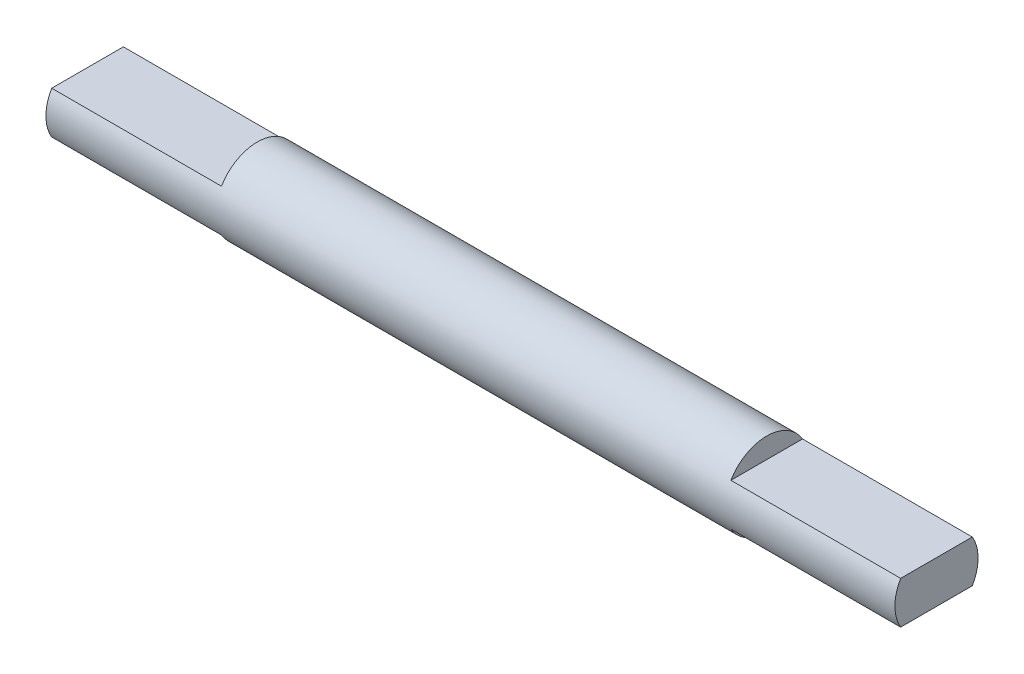
ISO-10303-21;
HEADER;
FILE_DESCRIPTION(('STEP AP214'),'2;1');
FILE_NAME('part.step','',(''),(''),'','','');
FILE_SCHEMA(('AUTOMOTIVE_DESIGN { 1 0 10303 214 1 1 1 1 }'));
ENDSEC;
DATA;
#1=APPLICATION_CONTEXT('core data for automotive mechanical design processes');
#2=APPLICATION_PROTOCOL_DEFINITION('international standard','automotive_design',2000,#1);
#3=PRODUCT_CONTEXT('',#1,'mechanical');
#4=PRODUCT('Part','Part','',(#3));
#5=PRODUCT_RELATED_PRODUCT_CATEGORY('part','',(#4));
#6=PRODUCT_DEFINITION_FORMATION('','',#4);
#7=PRODUCT_DEFINITION_CONTEXT('part definition',#1,'design');
#8=PRODUCT_DEFINITION('design','',#6,#7);
#9=PRODUCT_DEFINITION_SHAPE('','',#8);
#10=(LENGTH_UNIT() NAMED_UNIT(*) SI_UNIT(.MILLI.,.METRE.));
#11=(NAMED_UNIT(*) PLANE_ANGLE_UNIT() SI_UNIT($,.RADIAN.));
#12=(NAMED_UNIT(*) SI_UNIT($,.STERADIAN.) SOLID_ANGLE_UNIT());
#13=UNCERTAINTY_MEASURE_WITH_UNIT(LENGTH_MEASURE(1.E-05),#10,'distance_accuracy_value','');
#14=(GEOMETRIC_REPRESENTATION_CONTEXT(3) GLOBAL_UNCERTAINTY_ASSIGNED_CONTEXT((#13)) GLOBAL_UNIT_ASSIGNED_CONTEXT((#10,
#11,#12)) REPRESENTATION_CONTEXT('',''));
#15=CARTESIAN_POINT('',(0.,0.,0.));
#16=DIRECTION('',(0.,0.,1.));
#17=DIRECTION('',(1.,0.,0.));
#18=AXIS2_PLACEMENT_3D('',#15,#16,#17);
#19=CARTESIAN_POINT('',(50.,0.,0.));
#20=DIRECTION('',(-1.,0.,0.));
#21=DIRECTION('',(0.,0.,1.));
#22=AXIS2_PLACEMENT_3D('',#19,#20,#21);
#23=CYLINDRICAL_SURFACE('',#22,2.45);
#24=CARTESIAN_POINT('',(50.,0.,0.));
#25=DIRECTION('',(1.,0.,0.));
#26=DIRECTION('',(0.,0.,-1.));
#27=AXIS2_PLACEMENT_3D('',#24,#25,#26);
#28=CIRCLE('',#27,2.45);
#29=CARTESIAN_POINT('',(50.,-1.245,-2.1100888606881));
#30=VERTEX_POINT('',#29);
#31=CARTESIAN_POINT('',(50.,1.245,-2.1100888606881));
#32=VERTEX_POINT('',#31);
#33=EDGE_CURVE('E40',#30,#32,#28,.T.);
#34=ORIENTED_EDGE('',*,*,#33,.F.);
#35=DIRECTION('',(1.,0.,0.));
#36=VECTOR('',#35,1.);
#37=CARTESIAN_POINT('',(40.,-1.245,-2.1100888606881));
#38=LINE('',#37,#36);
#39=CARTESIAN_POINT('',(40.,-1.245,-2.1100888606881));
#40=VERTEX_POINT('',#39);
#41=EDGE_CURVE('E132',#40,#30,#38,.T.);
#42=ORIENTED_EDGE('',*,*,#41,.F.);
#43=CARTESIAN_POINT('',(40.,0.,0.));
#44=DIRECTION('',(1.,0.,0.));
#45=DIRECTION('',(0.,0.,-1.));
#46=AXIS2_PLACEMENT_3D('',#43,#44,#45);
#47=CIRCLE('',#46,2.45);
#48=CARTESIAN_POINT('',(40.,-1.245,2.1100888606881));
#49=VERTEX_POINT('',#48);
#50=EDGE_CURVE('E127',#49,#40,#47,.T.);
#51=ORIENTED_EDGE('',*,*,#50,.F.);
#52=DIRECTION('',(1.,0.,0.));
#53=VECTOR('',#52,1.);
#54=CARTESIAN_POINT('',(40.,-1.245,2.1100888606881));
#55=LINE('',#54,#53);
#56=CARTESIAN_POINT('',(50.,-1.245,2.1100888606881));
#57=VERTEX_POINT('',#56);
#58=EDGE_CURVE('E134',#49,#57,#55,.T.);
#59=ORIENTED_EDGE('',*,*,#58,.T.);
#60=CARTESIAN_POINT('',(50.,1.245,2.1100888606881));
#61=VERTEX_POINT('',#60);
#62=EDGE_CURVE('E11',#61,#57,#28,.T.);
#63=ORIENTED_EDGE('',*,*,#62,.F.);
#64=DIRECTION('',(1.,0.,0.));
#65=VECTOR('',#64,1.);
#66=CARTESIAN_POINT('',(40.,1.245,2.1100888606881));
#67=LINE('',#66,#65);
#68=CARTESIAN_POINT('',(40.,1.245,2.1100888606881));
#69=VERTEX_POINT('',#68);
#70=EDGE_CURVE('E144',#69,#61,#67,.T.);
#71=ORIENTED_EDGE('',*,*,#70,.F.);
#72=CARTESIAN_POINT('',(40.,0.,0.));
#73=DIRECTION('',(1.,0.,0.));
#74=DIRECTION('',(0.,0.,1.));
#75=AXIS2_PLACEMENT_3D('',#72,#73,#74);
#76=CIRCLE('',#75,2.45);
#77=CARTESIAN_POINT('',(40.,1.245,-2.1100888606881));
#78=VERTEX_POINT('',#77);
#79=EDGE_CURVE('E139',#78,#69,#76,.T.);
#80=ORIENTED_EDGE('',*,*,#79,.F.);
#81=DIRECTION('',(1.,0.,0.));
#82=VECTOR('',#81,1.);
#83=CARTESIAN_POINT('',(40.,1.245,-2.1100888606881));
#84=LINE('',#83,#82);
#85=EDGE_CURVE('E147',#78,#32,#84,.T.);
#86=ORIENTED_EDGE('',*,*,#85,.T.);
#87=EDGE_LOOP('',(#34,#42,#51,#59,#63,#71,#80,#86));
#88=FACE_BOUND('',#87,.T.);
#89=DIRECTION('',(-1.,0.,0.));
#90=VECTOR('',#89,1.);
#91=CARTESIAN_POINT('',(10.,-1.245,2.1100888606881));
#92=LINE('',#91,#90);
#93=CARTESIAN_POINT('',(10.,-1.245,2.1100888606881));
#94=VERTEX_POINT('',#93);
#95=CARTESIAN_POINT('',(0.,-1.245,2.1100888606881));
#96=VERTEX_POINT('',#95);
#97=EDGE_CURVE('E47',#94,#96,#92,.T.);
#98=ORIENTED_EDGE('',*,*,#97,.F.);
#99=CARTESIAN_POINT('',(10.,0.,0.));
#100=DIRECTION('',(1.,0.,0.));
#101=DIRECTION('',(0.,0.,-1.));
#102=AXIS2_PLACEMENT_3D('',#99,#100,#101);
#103=CIRCLE('',#102,2.45);
#104=CARTESIAN_POINT('',(10.,-1.245,-2.1100888606881));
#105=VERTEX_POINT('',#104);
#106=EDGE_CURVE('E102',#94,#105,#103,.T.);
#107=ORIENTED_EDGE('',*,*,#106,.T.);
#108=DIRECTION('',(-1.,0.,0.));
#109=VECTOR('',#108,1.);
#110=CARTESIAN_POINT('',(10.,-1.245,-2.1100888606881));
#111=LINE('',#110,#109);
#112=CARTESIAN_POINT('',(0.,-1.245,-2.1100888606881));
#113=VERTEX_POINT('',#112);
#114=EDGE_CURVE('E104',#105,#113,#111,.T.);
#115=ORIENTED_EDGE('',*,*,#114,.T.);
#116=CARTESIAN_POINT('',(0.,0.,0.));
#117=DIRECTION('',(1.,0.,0.));
#118=DIRECTION('',(0.,0.,-1.));
#119=AXIS2_PLACEMENT_3D('',#116,#117,#118);
#120=CIRCLE('',#119,2.45);
#121=CARTESIAN_POINT('',(0.,1.245,-2.1100888606881));
#122=VERTEX_POINT('',#121);
#123=EDGE_CURVE('E55',#113,#122,#120,.T.);
#124=ORIENTED_EDGE('',*,*,#123,.T.);
#125=DIRECTION('',(-1.,0.,0.));
#126=VECTOR('',#125,1.);
#127=CARTESIAN_POINT('',(10.,1.245,-2.1100888606881));
#128=LINE('',#127,#126);
#129=CARTESIAN_POINT('',(10.,1.245,-2.1100888606881));
#130=VERTEX_POINT('',#129);
#131=EDGE_CURVE('E119',#130,#122,#128,.T.);
#132=ORIENTED_EDGE('',*,*,#131,.F.);
#133=CARTESIAN_POINT('',(10.,0.,0.));
#134=DIRECTION('',(1.,0.,0.));
#135=DIRECTION('',(0.,0.,-1.));
#136=AXIS2_PLACEMENT_3D('',#133,#134,#135);
#137=CIRCLE('',#136,2.45);
#138=CARTESIAN_POINT('',(10.,1.245,2.1100888606881));
#139=VERTEX_POINT('',#138);
#140=EDGE_CURVE('E114',#130,#139,#137,.T.);
#141=ORIENTED_EDGE('',*,*,#140,.T.);
#142=DIRECTION('',(-1.,0.,0.));
#143=VECTOR('',#142,1.);
#144=CARTESIAN_POINT('',(10.,1.245,2.1100888606881));
#145=LINE('',#144,#143);
#146=CARTESIAN_POINT('',(0.,1.245,2.1100888606881));
#147=VERTEX_POINT('',#146);
#148=EDGE_CURVE('E123',#139,#147,#145,.T.);
#149=ORIENTED_EDGE('',*,*,#148,.T.);
#150=EDGE_CURVE('E35',#147,#96,#120,.T.);
#151=ORIENTED_EDGE('',*,*,#150,.T.);
#152=EDGE_LOOP('',(#98,#107,#115,#124,#132,#141,#149,#151));
#153=FACE_BOUND('',#152,.T.);
#154=ADVANCED_FACE('F32',(#88,#153),#23,.T.);
#155=CARTESIAN_POINT('',(0.,0.,0.));
#156=DIRECTION('',(1.,0.,0.));
#157=DIRECTION('',(0.,0.,-1.));
#158=AXIS2_PLACEMENT_3D('',#155,#156,#157);
#159=PLANE('',#158);
#160=DIRECTION('',(0.,0.,1.));
#161=VECTOR('',#160,1.);
#162=CARTESIAN_POINT('',(0.,-1.245,0.));
#163=LINE('',#162,#161);
#164=EDGE_CURVE('E106',#113,#96,#163,.T.);
#165=ORIENTED_EDGE('',*,*,#164,.T.);
#166=ORIENTED_EDGE('',*,*,#150,.F.);
#167=DIRECTION('',(0.,0.,-1.));
#168=VECTOR('',#167,1.);
#169=CARTESIAN_POINT('',(0.,1.245,0.));
#170=LINE('',#169,#168);
#171=EDGE_CURVE('E107',#147,#122,#170,.T.);
#172=ORIENTED_EDGE('',*,*,#171,.T.);
#173=ORIENTED_EDGE('',*,*,#123,.F.);
#174=EDGE_LOOP('',(#165,#166,#172,#173));
#175=FACE_BOUND('',#174,.T.);
#176=ADVANCED_FACE('F182',(#175),#159,.F.);
#177=CARTESIAN_POINT('',(50.,0.,0.));
#178=DIRECTION('',(1.,0.,0.));
#179=DIRECTION('',(0.,0.,-1.));
#180=AXIS2_PLACEMENT_3D('',#177,#178,#179);
#181=PLANE('',#180);
#182=DIRECTION('',(0.,0.,1.));
#183=VECTOR('',#182,1.);
#184=CARTESIAN_POINT('',(50.,-1.245,2.1100888606881));
#185=LINE('',#184,#183);
#186=EDGE_CURVE('E126',#30,#57,#185,.T.);
#187=ORIENTED_EDGE('',*,*,#186,.F.);
#188=ORIENTED_EDGE('',*,*,#33,.T.);
#189=DIRECTION('',(0.,0.,-1.));
#190=VECTOR('',#189,1.);
#191=CARTESIAN_POINT('',(50.,1.245,2.1100888606881));
#192=LINE('',#191,#190);
#193=EDGE_CURVE('E137',#61,#32,#192,.T.);
#194=ORIENTED_EDGE('',*,*,#193,.F.);
#195=ORIENTED_EDGE('',*,*,#62,.T.);
#196=EDGE_LOOP('',(#187,#188,#194,#195));
#197=FACE_BOUND('',#196,.T.);
#198=ADVANCED_FACE('F160',(#197),#181,.T.);
#199=CARTESIAN_POINT('',(40.,1.245,2.1100888606881));
#200=DIRECTION('',(0.,-1.,0.));
#201=DIRECTION('',(0.,0.,-1.));
#202=AXIS2_PLACEMENT_3D('',#199,#200,#201);
#203=PLANE('',#202);
#204=ORIENTED_EDGE('',*,*,#193,.T.);
#205=ORIENTED_EDGE('',*,*,#85,.F.);
#206=DIRECTION('',(0.,0.,-1.));
#207=VECTOR('',#206,1.);
#208=CARTESIAN_POINT('',(40.,1.245,2.1100888606881));
#209=LINE('',#208,#207);
#210=EDGE_CURVE('E141',#69,#78,#209,.T.);
#211=ORIENTED_EDGE('',*,*,#210,.F.);
#212=ORIENTED_EDGE('',*,*,#70,.T.);
#213=EDGE_LOOP('',(#204,#205,#211,#212));
#214=FACE_BOUND('',#213,.T.);
#215=ADVANCED_FACE('F154',(#214),#203,.F.);
#216=CARTESIAN_POINT('',(40.,0.,0.));
#217=DIRECTION('',(-1.,0.,0.));
#218=DIRECTION('',(0.,0.,1.));
#219=AXIS2_PLACEMENT_3D('',#216,#217,#218);
#220=PLANE('',#219);
#221=ORIENTED_EDGE('',*,*,#79,.T.);
#222=ORIENTED_EDGE('',*,*,#210,.T.);
#223=EDGE_LOOP('',(#221,#222));
#224=FACE_BOUND('',#223,.T.);
#225=ADVANCED_FACE('F179',(#224),#220,.F.);
#226=CARTESIAN_POINT('',(40.,-1.245,2.1100888606881));
#227=DIRECTION('',(0.,1.,0.));
#228=DIRECTION('',(0.,0.,1.));
#229=AXIS2_PLACEMENT_3D('',#226,#227,#228);
#230=PLANE('',#229);
#231=ORIENTED_EDGE('',*,*,#186,.T.);
#232=ORIENTED_EDGE('',*,*,#58,.F.);
#233=DIRECTION('',(0.,0.,1.));
#234=VECTOR('',#233,1.);
#235=CARTESIAN_POINT('',(40.,-1.245,2.1100888606881));
#236=LINE('',#235,#234);
#237=EDGE_CURVE('E129',#40,#49,#236,.T.);
#238=ORIENTED_EDGE('',*,*,#237,.F.);
#239=ORIENTED_EDGE('',*,*,#41,.T.);
#240=EDGE_LOOP('',(#231,#232,#238,#239));
#241=FACE_BOUND('',#240,.T.);
#242=ADVANCED_FACE('F166',(#241),#230,.F.);
#243=CARTESIAN_POINT('',(40.,0.,0.));
#244=DIRECTION('',(1.,0.,0.));
#245=DIRECTION('',(0.,0.,-1.));
#246=AXIS2_PLACEMENT_3D('',#243,#244,#245);
#247=PLANE('',#246);
#248=ORIENTED_EDGE('',*,*,#50,.T.);
#249=ORIENTED_EDGE('',*,*,#237,.T.);
#250=EDGE_LOOP('',(#248,#249));
#251=FACE_BOUND('',#250,.T.);
#252=ADVANCED_FACE('F168',(#251),#247,.T.);
#253=CARTESIAN_POINT('',(10.,1.245,0.));
#254=DIRECTION('',(0.,1.,0.));
#255=DIRECTION('',(0.,0.,1.));
#256=AXIS2_PLACEMENT_3D('',#253,#254,#255);
#257=PLANE('',#256);
#258=ORIENTED_EDGE('',*,*,#171,.F.);
#259=ORIENTED_EDGE('',*,*,#148,.F.);
#260=DIRECTION('',(0.,0.,-1.));
#261=VECTOR('',#260,1.);
#262=CARTESIAN_POINT('',(10.,1.245,0.));
#263=LINE('',#262,#261);
#264=EDGE_CURVE('E117',#139,#130,#263,.T.);
#265=ORIENTED_EDGE('',*,*,#264,.T.);
#266=ORIENTED_EDGE('',*,*,#131,.T.);
#267=EDGE_LOOP('',(#258,#259,#265,#266));
#268=FACE_BOUND('',#267,.T.);
#269=ADVANCED_FACE('F170',(#268),#257,.T.);
#270=CARTESIAN_POINT('',(10.,0.,0.));
#271=DIRECTION('',(1.,0.,0.));
#272=DIRECTION('',(0.,0.,-1.));
#273=AXIS2_PLACEMENT_3D('',#270,#271,#272);
#274=PLANE('',#273);
#275=ORIENTED_EDGE('',*,*,#140,.F.);
#276=ORIENTED_EDGE('',*,*,#264,.F.);
#277=EDGE_LOOP('',(#275,#276));
#278=FACE_BOUND('',#277,.T.);
#279=ADVANCED_FACE('F176',(#278),#274,.F.);
#280=CARTESIAN_POINT('',(10.,-1.245,0.));
#281=DIRECTION('',(0.,-1.,0.));
#282=DIRECTION('',(0.,0.,-1.));
#283=AXIS2_PLACEMENT_3D('',#280,#281,#282);
#284=PLANE('',#283);
#285=ORIENTED_EDGE('',*,*,#164,.F.);
#286=ORIENTED_EDGE('',*,*,#114,.F.);
#287=DIRECTION('',(0.,0.,1.));
#288=VECTOR('',#287,1.);
#289=CARTESIAN_POINT('',(10.,-1.245,0.));
#290=LINE('',#289,#288);
#291=EDGE_CURVE('E98',#105,#94,#290,.T.);
#292=ORIENTED_EDGE('',*,*,#291,.T.);
#293=ORIENTED_EDGE('',*,*,#97,.T.);
#294=EDGE_LOOP('',(#285,#286,#292,#293));
#295=FACE_BOUND('',#294,.T.);
#296=ADVANCED_FACE('F105',(#295),#284,.T.);
#297=CARTESIAN_POINT('',(10.,0.,0.));
#298=DIRECTION('',(1.,0.,0.));
#299=DIRECTION('',(0.,0.,-1.));
#300=AXIS2_PLACEMENT_3D('',#297,#298,#299);
#301=PLANE('',#300);
#302=ORIENTED_EDGE('',*,*,#106,.F.);
#303=ORIENTED_EDGE('',*,*,#291,.F.);
#304=EDGE_LOOP('',(#302,#303));
#305=FACE_BOUND('',#304,.T.);
#306=ADVANCED_FACE('F100',(#305),#301,.F.);
#307=CLOSED_SHELL('',(#154,#176,#198,#215,#225,#242,#252,#269,#279,#296,#306));
#308=MANIFOLD_SOLID_BREP('B2',#307);
#309=ADVANCED_BREP_SHAPE_REPRESENTATION('',(#18,#308),#14);
#310=SHAPE_DEFINITION_REPRESENTATION(#9,#309);
ENDSEC;
END-ISO-10303-21;
